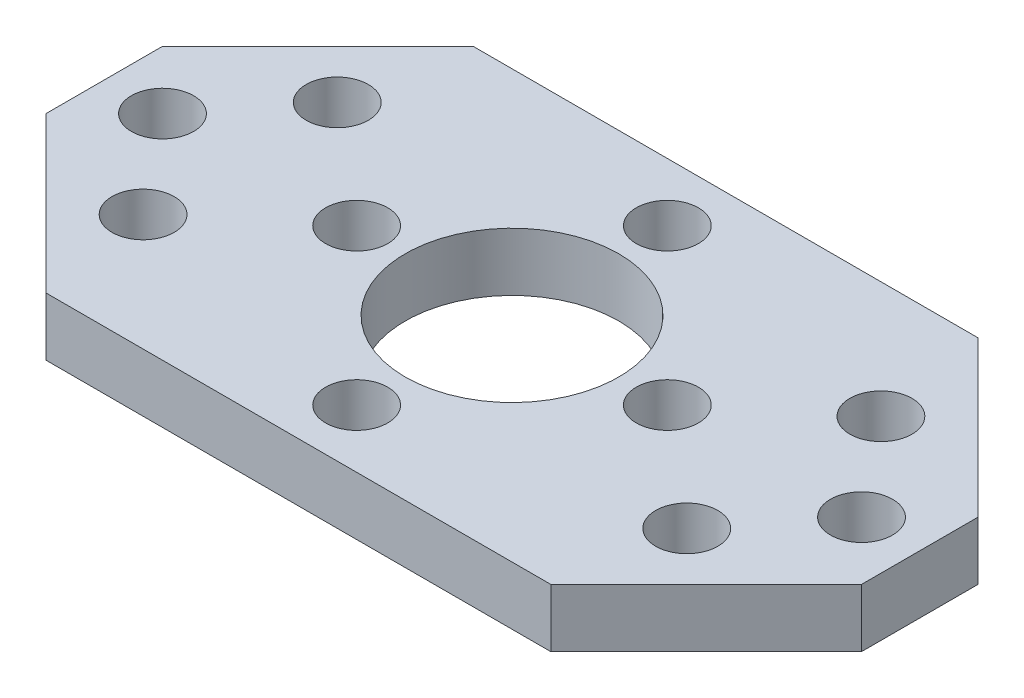
ISO-10303-21;
HEADER;
FILE_DESCRIPTION(('STEP AP214'),'2;1');
FILE_NAME('part.step','',(''),(''),'','','');
FILE_SCHEMA(('AUTOMOTIVE_DESIGN { 1 0 10303 214 1 1 1 1 }'));
ENDSEC;
DATA;
#1=APPLICATION_CONTEXT('core data for automotive mechanical design processes');
#2=APPLICATION_PROTOCOL_DEFINITION('international standard','automotive_design',2000,#1);
#3=PRODUCT_CONTEXT('',#1,'mechanical');
#4=PRODUCT('Part','Part','',(#3));
#5=PRODUCT_RELATED_PRODUCT_CATEGORY('part','',(#4));
#6=PRODUCT_DEFINITION_FORMATION('','',#4);
#7=PRODUCT_DEFINITION_CONTEXT('part definition',#1,'design');
#8=PRODUCT_DEFINITION('design','',#6,#7);
#9=PRODUCT_DEFINITION_SHAPE('','',#8);
#10=(LENGTH_UNIT() NAMED_UNIT(*) SI_UNIT(.MILLI.,.METRE.));
#11=(NAMED_UNIT(*) PLANE_ANGLE_UNIT() SI_UNIT($,.RADIAN.));
#12=(NAMED_UNIT(*) SI_UNIT($,.STERADIAN.) SOLID_ANGLE_UNIT());
#13=UNCERTAINTY_MEASURE_WITH_UNIT(LENGTH_MEASURE(1.E-05),#10,'distance_accuracy_value','');
#14=(GEOMETRIC_REPRESENTATION_CONTEXT(3) GLOBAL_UNCERTAINTY_ASSIGNED_CONTEXT((#13)) GLOBAL_UNIT_ASSIGNED_CONTEXT((#10,
#11,#12)) REPRESENTATION_CONTEXT('',''));
#15=CARTESIAN_POINT('',(0.,0.,0.));
#16=DIRECTION('',(0.,0.,1.));
#17=DIRECTION('',(1.,0.,0.));
#18=AXIS2_PLACEMENT_3D('',#15,#16,#17);
#19=CARTESIAN_POINT('',(0.,3.,0.));
#20=DIRECTION('',(0.,-1.,0.));
#21=DIRECTION('',(0.,0.,-1.));
#22=AXIS2_PLACEMENT_3D('',#19,#20,#21);
#23=PLANE('',#22);
#24=DIRECTION('',(0.,0.,1.));
#25=VECTOR('',#24,1.);
#26=CARTESIAN_POINT('',(-21.,3.,3.));
#27=LINE('',#26,#25);
#28=CARTESIAN_POINT('',(-21.,3.,-3.));
#29=VERTEX_POINT('',#28);
#30=CARTESIAN_POINT('',(-21.,3.,3.));
#31=VERTEX_POINT('',#30);
#32=EDGE_CURVE('E171',#29,#31,#27,.T.);
#33=ORIENTED_EDGE('',*,*,#32,.T.);
#34=DIRECTION('',(0.707106781186548,0.,0.707106781186548));
#35=VECTOR('',#34,1.);
#36=CARTESIAN_POINT('',(-21.,3.,3.));
#37=LINE('',#36,#35);
#38=CARTESIAN_POINT('',(-13.,3.,11.));
#39=VERTEX_POINT('',#38);
#40=EDGE_CURVE('E106',#31,#39,#37,.T.);
#41=ORIENTED_EDGE('',*,*,#40,.T.);
#42=DIRECTION('',(1.,0.,0.));
#43=VECTOR('',#42,1.);
#44=CARTESIAN_POINT('',(-13.,3.,11.));
#45=LINE('',#44,#43);
#46=CARTESIAN_POINT('',(13.,3.,11.));
#47=VERTEX_POINT('',#46);
#48=EDGE_CURVE('E194',#39,#47,#45,.T.);
#49=ORIENTED_EDGE('',*,*,#48,.T.);
#50=DIRECTION('',(0.707106781186548,0.,-0.707106781186548));
#51=VECTOR('',#50,1.);
#52=CARTESIAN_POINT('',(13.,3.,11.));
#53=LINE('',#52,#51);
#54=CARTESIAN_POINT('',(21.,3.,3.));
#55=VERTEX_POINT('',#54);
#56=EDGE_CURVE('E208',#47,#55,#53,.T.);
#57=ORIENTED_EDGE('',*,*,#56,.T.);
#58=DIRECTION('',(0.,0.,-1.));
#59=VECTOR('',#58,1.);
#60=CARTESIAN_POINT('',(21.,3.,3.));
#61=LINE('',#60,#59);
#62=CARTESIAN_POINT('',(21.,3.,-3.));
#63=VERTEX_POINT('',#62);
#64=EDGE_CURVE('E125',#55,#63,#61,.T.);
#65=ORIENTED_EDGE('',*,*,#64,.T.);
#66=DIRECTION('',(-0.707106781186548,0.,-0.707106781186548));
#67=VECTOR('',#66,1.);
#68=CARTESIAN_POINT('',(13.,3.,-11.));
#69=LINE('',#68,#67);
#70=CARTESIAN_POINT('',(13.,3.,-11.));
#71=VERTEX_POINT('',#70);
#72=EDGE_CURVE('E119',#63,#71,#69,.T.);
#73=ORIENTED_EDGE('',*,*,#72,.T.);
#74=DIRECTION('',(-1.,0.,0.));
#75=VECTOR('',#74,1.);
#76=CARTESIAN_POINT('',(-13.,3.,-11.));
#77=LINE('',#76,#75);
#78=CARTESIAN_POINT('',(-13.,3.,-11.));
#79=VERTEX_POINT('',#78);
#80=EDGE_CURVE('E123',#71,#79,#77,.T.);
#81=ORIENTED_EDGE('',*,*,#80,.T.);
#82=DIRECTION('',(-0.707106781186548,0.,0.707106781186548));
#83=VECTOR('',#82,1.);
#84=CARTESIAN_POINT('',(-21.,3.,-3.));
#85=LINE('',#84,#83);
#86=EDGE_CURVE('E63',#79,#29,#85,.T.);
#87=ORIENTED_EDGE('',*,*,#86,.T.);
#88=EDGE_LOOP('',(#33,#41,#49,#57,#65,#73,#81,#87));
#89=FACE_BOUND('',#88,.T.);
#90=CARTESIAN_POINT('',(0.,3.,8.));
#91=DIRECTION('',(0.,1.,0.));
#92=DIRECTION('',(0.,0.,-1.));
#93=AXIS2_PLACEMENT_3D('',#90,#91,#92);
#94=CIRCLE('',#93,1.6);
#95=CARTESIAN_POINT('',(0.,3.,6.4));
#96=VERTEX_POINT('',#95);
#97=EDGE_CURVE('E154',#96,#96,#94,.T.);
#98=ORIENTED_EDGE('',*,*,#97,.F.);
#99=EDGE_LOOP('',(#98));
#100=FACE_BOUND('',#99,.T.);
#101=CARTESIAN_POINT('',(0.,3.,-8.));
#102=DIRECTION('',(0.,1.,0.));
#103=DIRECTION('',(0.,0.,1.));
#104=AXIS2_PLACEMENT_3D('',#101,#102,#103);
#105=CIRCLE('',#104,1.6);
#106=CARTESIAN_POINT('',(0.,3.,-6.4));
#107=VERTEX_POINT('',#106);
#108=EDGE_CURVE('E223',#107,#107,#105,.T.);
#109=ORIENTED_EDGE('',*,*,#108,.F.);
#110=EDGE_LOOP('',(#109));
#111=FACE_BOUND('',#110,.T.);
#112=CARTESIAN_POINT('',(8.,3.,0.));
#113=DIRECTION('',(0.,1.,0.));
#114=DIRECTION('',(0.,0.,1.));
#115=AXIS2_PLACEMENT_3D('',#112,#113,#114);
#116=CIRCLE('',#115,1.6);
#117=CARTESIAN_POINT('',(8.,3.,1.6));
#118=VERTEX_POINT('',#117);
#119=EDGE_CURVE('E230',#118,#118,#116,.T.);
#120=ORIENTED_EDGE('',*,*,#119,.F.);
#121=EDGE_LOOP('',(#120));
#122=FACE_BOUND('',#121,.T.);
#123=CARTESIAN_POINT('',(-8.,3.,0.));
#124=DIRECTION('',(0.,1.,0.));
#125=DIRECTION('',(0.,0.,-1.));
#126=AXIS2_PLACEMENT_3D('',#123,#124,#125);
#127=CIRCLE('',#126,1.6);
#128=CARTESIAN_POINT('',(-8.,3.,-1.6));
#129=VERTEX_POINT('',#128);
#130=EDGE_CURVE('E237',#129,#129,#127,.T.);
#131=ORIENTED_EDGE('',*,*,#130,.F.);
#132=EDGE_LOOP('',(#131));
#133=FACE_BOUND('',#132,.T.);
#134=CARTESIAN_POINT('',(-18.,3.,0.));
#135=DIRECTION('',(0.,1.,0.));
#136=DIRECTION('',(0.,0.,1.));
#137=AXIS2_PLACEMENT_3D('',#134,#135,#136);
#138=CIRCLE('',#137,1.6);
#139=CARTESIAN_POINT('',(-18.,3.,1.6));
#140=VERTEX_POINT('',#139);
#141=EDGE_CURVE('E245',#140,#140,#138,.T.);
#142=ORIENTED_EDGE('',*,*,#141,.F.);
#143=EDGE_LOOP('',(#142));
#144=FACE_BOUND('',#143,.T.);
#145=CARTESIAN_POINT('',(-14.,3.,-5.));
#146=DIRECTION('',(0.,1.,0.));
#147=DIRECTION('',(0.,0.,1.));
#148=AXIS2_PLACEMENT_3D('',#145,#146,#147);
#149=CIRCLE('',#148,1.6);
#150=CARTESIAN_POINT('',(-14.,3.,-3.4));
#151=VERTEX_POINT('',#150);
#152=EDGE_CURVE('E253',#151,#151,#149,.T.);
#153=ORIENTED_EDGE('',*,*,#152,.F.);
#154=EDGE_LOOP('',(#153));
#155=FACE_BOUND('',#154,.T.);
#156=CARTESIAN_POINT('',(-14.,3.,5.));
#157=DIRECTION('',(0.,1.,0.));
#158=DIRECTION('',(0.,0.,-1.));
#159=AXIS2_PLACEMENT_3D('',#156,#157,#158);
#160=CIRCLE('',#159,1.6);
#161=CARTESIAN_POINT('',(-14.,3.,3.4));
#162=VERTEX_POINT('',#161);
#163=EDGE_CURVE('E260',#162,#162,#160,.T.);
#164=ORIENTED_EDGE('',*,*,#163,.F.);
#165=EDGE_LOOP('',(#164));
#166=FACE_BOUND('',#165,.T.);
#167=CARTESIAN_POINT('',(14.,3.,5.));
#168=DIRECTION('',(0.,1.,0.));
#169=DIRECTION('',(0.,0.,1.));
#170=AXIS2_PLACEMENT_3D('',#167,#168,#169);
#171=CIRCLE('',#170,1.6);
#172=CARTESIAN_POINT('',(14.,3.,6.6));
#173=VERTEX_POINT('',#172);
#174=EDGE_CURVE('E268',#173,#173,#171,.T.);
#175=ORIENTED_EDGE('',*,*,#174,.F.);
#176=EDGE_LOOP('',(#175));
#177=FACE_BOUND('',#176,.T.);
#178=CARTESIAN_POINT('',(18.,3.,0.));
#179=DIRECTION('',(0.,1.,0.));
#180=DIRECTION('',(0.,0.,-1.));
#181=AXIS2_PLACEMENT_3D('',#178,#179,#180);
#182=CIRCLE('',#181,1.6);
#183=CARTESIAN_POINT('',(18.,3.,-1.6));
#184=VERTEX_POINT('',#183);
#185=EDGE_CURVE('E275',#184,#184,#182,.T.);
#186=ORIENTED_EDGE('',*,*,#185,.F.);
#187=EDGE_LOOP('',(#186));
#188=FACE_BOUND('',#187,.T.);
#189=CARTESIAN_POINT('',(14.,3.,-5.));
#190=DIRECTION('',(0.,1.,0.));
#191=DIRECTION('',(0.,0.,-1.));
#192=AXIS2_PLACEMENT_3D('',#189,#190,#191);
#193=CIRCLE('',#192,1.6);
#194=CARTESIAN_POINT('',(14.,3.,-6.6));
#195=VERTEX_POINT('',#194);
#196=EDGE_CURVE('E283',#195,#195,#193,.T.);
#197=ORIENTED_EDGE('',*,*,#196,.F.);
#198=EDGE_LOOP('',(#197));
#199=FACE_BOUND('',#198,.T.);
#200=CARTESIAN_POINT('',(0.,3.,0.));
#201=DIRECTION('',(0.,1.,0.));
#202=DIRECTION('',(0.,0.,1.));
#203=AXIS2_PLACEMENT_3D('',#200,#201,#202);
#204=CIRCLE('',#203,5.5);
#205=CARTESIAN_POINT('',(0.,3.,5.5));
#206=VERTEX_POINT('',#205);
#207=EDGE_CURVE('E291',#206,#206,#204,.T.);
#208=ORIENTED_EDGE('',*,*,#207,.F.);
#209=EDGE_LOOP('',(#208));
#210=FACE_BOUND('',#209,.T.);
#211=ADVANCED_FACE('F45',(#89,#100,#111,#122,#133,#144,#155,#166,#177,#188,#199,#210),#23,.F.);
#212=CARTESIAN_POINT('',(0.,0.,0.));
#213=DIRECTION('',(0.,-1.,0.));
#214=DIRECTION('',(0.,0.,-1.));
#215=AXIS2_PLACEMENT_3D('',#212,#213,#214);
#216=PLANE('',#215);
#217=CARTESIAN_POINT('',(14.,0.,-5.));
#218=DIRECTION('',(0.,1.,0.));
#219=DIRECTION('',(0.,0.,-1.));
#220=AXIS2_PLACEMENT_3D('',#217,#218,#219);
#221=CIRCLE('',#220,1.6);
#222=CARTESIAN_POINT('',(14.,0.,-6.6));
#223=VERTEX_POINT('',#222);
#224=EDGE_CURVE('E287',#223,#223,#221,.T.);
#225=ORIENTED_EDGE('',*,*,#224,.T.);
#226=EDGE_LOOP('',(#225));
#227=FACE_BOUND('',#226,.T.);
#228=CARTESIAN_POINT('',(14.,0.,5.));
#229=DIRECTION('',(0.,1.,0.));
#230=DIRECTION('',(0.,0.,1.));
#231=AXIS2_PLACEMENT_3D('',#228,#229,#230);
#232=CIRCLE('',#231,1.6);
#233=CARTESIAN_POINT('',(14.,0.,6.6));
#234=VERTEX_POINT('',#233);
#235=EDGE_CURVE('E272',#234,#234,#232,.T.);
#236=ORIENTED_EDGE('',*,*,#235,.T.);
#237=EDGE_LOOP('',(#236));
#238=FACE_BOUND('',#237,.T.);
#239=CARTESIAN_POINT('',(-14.,0.,-5.));
#240=DIRECTION('',(0.,1.,0.));
#241=DIRECTION('',(0.,0.,1.));
#242=AXIS2_PLACEMENT_3D('',#239,#240,#241);
#243=CIRCLE('',#242,1.6);
#244=CARTESIAN_POINT('',(-14.,0.,-3.4));
#245=VERTEX_POINT('',#244);
#246=EDGE_CURVE('E257',#245,#245,#243,.T.);
#247=ORIENTED_EDGE('',*,*,#246,.T.);
#248=EDGE_LOOP('',(#247));
#249=FACE_BOUND('',#248,.T.);
#250=CARTESIAN_POINT('',(-8.,0.,0.));
#251=DIRECTION('',(0.,1.,0.));
#252=DIRECTION('',(0.,0.,-1.));
#253=AXIS2_PLACEMENT_3D('',#250,#251,#252);
#254=CIRCLE('',#253,1.6);
#255=CARTESIAN_POINT('',(-8.,0.,-1.6));
#256=VERTEX_POINT('',#255);
#257=EDGE_CURVE('E241',#256,#256,#254,.T.);
#258=ORIENTED_EDGE('',*,*,#257,.T.);
#259=EDGE_LOOP('',(#258));
#260=FACE_BOUND('',#259,.T.);
#261=CARTESIAN_POINT('',(0.,0.,-8.));
#262=DIRECTION('',(0.,1.,0.));
#263=DIRECTION('',(0.,0.,1.));
#264=AXIS2_PLACEMENT_3D('',#261,#262,#263);
#265=CIRCLE('',#264,1.6);
#266=CARTESIAN_POINT('',(0.,0.,-6.4));
#267=VERTEX_POINT('',#266);
#268=EDGE_CURVE('E226',#267,#267,#265,.T.);
#269=ORIENTED_EDGE('',*,*,#268,.T.);
#270=EDGE_LOOP('',(#269));
#271=FACE_BOUND('',#270,.T.);
#272=DIRECTION('',(0.,0.,1.));
#273=VECTOR('',#272,1.);
#274=CARTESIAN_POINT('',(-21.,0.,3.));
#275=LINE('',#274,#273);
#276=CARTESIAN_POINT('',(-21.,0.,-3.));
#277=VERTEX_POINT('',#276);
#278=CARTESIAN_POINT('',(-21.,0.,3.));
#279=VERTEX_POINT('',#278);
#280=EDGE_CURVE('E149',#277,#279,#275,.T.);
#281=ORIENTED_EDGE('',*,*,#280,.F.);
#282=DIRECTION('',(-0.707106781186548,0.,0.707106781186548));
#283=VECTOR('',#282,1.);
#284=CARTESIAN_POINT('',(-21.,0.,-3.));
#285=LINE('',#284,#283);
#286=CARTESIAN_POINT('',(-13.,0.,-11.));
#287=VERTEX_POINT('',#286);
#288=EDGE_CURVE('E98',#287,#277,#285,.T.);
#289=ORIENTED_EDGE('',*,*,#288,.F.);
#290=DIRECTION('',(-1.,0.,0.));
#291=VECTOR('',#290,1.);
#292=CARTESIAN_POINT('',(-13.,0.,-11.));
#293=LINE('',#292,#291);
#294=CARTESIAN_POINT('',(13.,0.,-11.));
#295=VERTEX_POINT('',#294);
#296=EDGE_CURVE('E92',#295,#287,#293,.T.);
#297=ORIENTED_EDGE('',*,*,#296,.F.);
#298=DIRECTION('',(-0.707106781186548,0.,-0.707106781186548));
#299=VECTOR('',#298,1.);
#300=CARTESIAN_POINT('',(13.,0.,-11.));
#301=LINE('',#300,#299);
#302=CARTESIAN_POINT('',(21.,0.,-3.));
#303=VERTEX_POINT('',#302);
#304=EDGE_CURVE('E134',#303,#295,#301,.T.);
#305=ORIENTED_EDGE('',*,*,#304,.F.);
#306=DIRECTION('',(0.,0.,-1.));
#307=VECTOR('',#306,1.);
#308=CARTESIAN_POINT('',(21.,0.,3.));
#309=LINE('',#308,#307);
#310=CARTESIAN_POINT('',(21.,0.,3.));
#311=VERTEX_POINT('',#310);
#312=EDGE_CURVE('E163',#311,#303,#309,.T.);
#313=ORIENTED_EDGE('',*,*,#312,.F.);
#314=DIRECTION('',(0.707106781186548,0.,-0.707106781186548));
#315=VECTOR('',#314,1.);
#316=CARTESIAN_POINT('',(13.,0.,11.));
#317=LINE('',#316,#315);
#318=CARTESIAN_POINT('',(13.,0.,11.));
#319=VERTEX_POINT('',#318);
#320=EDGE_CURVE('E160',#319,#311,#317,.T.);
#321=ORIENTED_EDGE('',*,*,#320,.F.);
#322=DIRECTION('',(1.,0.,0.));
#323=VECTOR('',#322,1.);
#324=CARTESIAN_POINT('',(-13.,0.,11.));
#325=LINE('',#324,#323);
#326=CARTESIAN_POINT('',(-13.,0.,11.));
#327=VERTEX_POINT('',#326);
#328=EDGE_CURVE('E157',#327,#319,#325,.T.);
#329=ORIENTED_EDGE('',*,*,#328,.F.);
#330=DIRECTION('',(0.707106781186548,0.,0.707106781186548));
#331=VECTOR('',#330,1.);
#332=CARTESIAN_POINT('',(-21.,0.,3.));
#333=LINE('',#332,#331);
#334=EDGE_CURVE('E153',#279,#327,#333,.T.);
#335=ORIENTED_EDGE('',*,*,#334,.F.);
#336=EDGE_LOOP('',(#281,#289,#297,#305,#313,#321,#329,#335));
#337=FACE_BOUND('',#336,.T.);
#338=CARTESIAN_POINT('',(0.,0.,8.));
#339=DIRECTION('',(0.,1.,0.));
#340=DIRECTION('',(0.,0.,-1.));
#341=AXIS2_PLACEMENT_3D('',#338,#339,#340);
#342=CIRCLE('',#341,1.6);
#343=CARTESIAN_POINT('',(0.,0.,6.4));
#344=VERTEX_POINT('',#343);
#345=EDGE_CURVE('E219',#344,#344,#342,.T.);
#346=ORIENTED_EDGE('',*,*,#345,.T.);
#347=EDGE_LOOP('',(#346));
#348=FACE_BOUND('',#347,.T.);
#349=CARTESIAN_POINT('',(8.,0.,0.));
#350=DIRECTION('',(0.,1.,0.));
#351=DIRECTION('',(0.,0.,1.));
#352=AXIS2_PLACEMENT_3D('',#349,#350,#351);
#353=CIRCLE('',#352,1.6);
#354=CARTESIAN_POINT('',(8.,0.,1.6));
#355=VERTEX_POINT('',#354);
#356=EDGE_CURVE('E234',#355,#355,#353,.T.);
#357=ORIENTED_EDGE('',*,*,#356,.T.);
#358=EDGE_LOOP('',(#357));
#359=FACE_BOUND('',#358,.T.);
#360=CARTESIAN_POINT('',(-18.,0.,0.));
#361=DIRECTION('',(0.,1.,0.));
#362=DIRECTION('',(0.,0.,1.));
#363=AXIS2_PLACEMENT_3D('',#360,#361,#362);
#364=CIRCLE('',#363,1.6);
#365=CARTESIAN_POINT('',(-18.,0.,1.6));
#366=VERTEX_POINT('',#365);
#367=EDGE_CURVE('E249',#366,#366,#364,.T.);
#368=ORIENTED_EDGE('',*,*,#367,.T.);
#369=EDGE_LOOP('',(#368));
#370=FACE_BOUND('',#369,.T.);
#371=CARTESIAN_POINT('',(-14.,0.,5.));
#372=DIRECTION('',(0.,1.,0.));
#373=DIRECTION('',(0.,0.,-1.));
#374=AXIS2_PLACEMENT_3D('',#371,#372,#373);
#375=CIRCLE('',#374,1.6);
#376=CARTESIAN_POINT('',(-14.,0.,3.4));
#377=VERTEX_POINT('',#376);
#378=EDGE_CURVE('E264',#377,#377,#375,.T.);
#379=ORIENTED_EDGE('',*,*,#378,.T.);
#380=EDGE_LOOP('',(#379));
#381=FACE_BOUND('',#380,.T.);
#382=CARTESIAN_POINT('',(18.,0.,0.));
#383=DIRECTION('',(0.,1.,0.));
#384=DIRECTION('',(0.,0.,-1.));
#385=AXIS2_PLACEMENT_3D('',#382,#383,#384);
#386=CIRCLE('',#385,1.6);
#387=CARTESIAN_POINT('',(18.,0.,-1.6));
#388=VERTEX_POINT('',#387);
#389=EDGE_CURVE('E279',#388,#388,#386,.T.);
#390=ORIENTED_EDGE('',*,*,#389,.T.);
#391=EDGE_LOOP('',(#390));
#392=FACE_BOUND('',#391,.T.);
#393=CARTESIAN_POINT('',(0.,0.,0.));
#394=DIRECTION('',(0.,1.,0.));
#395=DIRECTION('',(0.,0.,1.));
#396=AXIS2_PLACEMENT_3D('',#393,#394,#395);
#397=CIRCLE('',#396,5.5);
#398=CARTESIAN_POINT('',(0.,0.,5.5));
#399=VERTEX_POINT('',#398);
#400=EDGE_CURVE('E295',#399,#399,#397,.T.);
#401=ORIENTED_EDGE('',*,*,#400,.T.);
#402=EDGE_LOOP('',(#401));
#403=FACE_BOUND('',#402,.T.);
#404=ADVANCED_FACE('F198',(#227,#238,#249,#260,#271,#337,#348,#359,#370,#381,#392,#403),#216,.T.);
#405=CARTESIAN_POINT('',(-21.,3.,3.));
#406=DIRECTION('',(1.,0.,0.));
#407=DIRECTION('',(0.,0.,-1.));
#408=AXIS2_PLACEMENT_3D('',#405,#406,#407);
#409=PLANE('',#408);
#410=ORIENTED_EDGE('',*,*,#280,.T.);
#411=DIRECTION('',(0.,-1.,0.));
#412=VECTOR('',#411,1.);
#413=CARTESIAN_POINT('',(-21.,3.,3.));
#414=LINE('',#413,#412);
#415=EDGE_CURVE('E11',#31,#279,#414,.T.);
#416=ORIENTED_EDGE('',*,*,#415,.F.);
#417=ORIENTED_EDGE('',*,*,#32,.F.);
#418=DIRECTION('',(0.,-1.,0.));
#419=VECTOR('',#418,1.);
#420=CARTESIAN_POINT('',(-21.,3.,-3.));
#421=LINE('',#420,#419);
#422=EDGE_CURVE('E145',#29,#277,#421,.T.);
#423=ORIENTED_EDGE('',*,*,#422,.T.);
#424=EDGE_LOOP('',(#410,#416,#417,#423));
#425=FACE_BOUND('',#424,.T.);
#426=ADVANCED_FACE('F47',(#425),#409,.F.);
#427=CARTESIAN_POINT('',(-21.,3.,3.));
#428=DIRECTION('',(0.707106781186547,0.,-0.707106781186547));
#429=DIRECTION('',(-0.707106781186548,0.,-0.707106781186548));
#430=AXIS2_PLACEMENT_3D('',#427,#428,#429);
#431=PLANE('',#430);
#432=ORIENTED_EDGE('',*,*,#334,.T.);
#433=DIRECTION('',(0.,-1.,0.));
#434=VECTOR('',#433,1.);
#435=CARTESIAN_POINT('',(-13.,3.,11.));
#436=LINE('',#435,#434);
#437=EDGE_CURVE('E55',#39,#327,#436,.T.);
#438=ORIENTED_EDGE('',*,*,#437,.F.);
#439=ORIENTED_EDGE('',*,*,#40,.F.);
#440=ORIENTED_EDGE('',*,*,#415,.T.);
#441=EDGE_LOOP('',(#432,#438,#439,#440));
#442=FACE_BOUND('',#441,.T.);
#443=ADVANCED_FACE('F328',(#442),#431,.F.);
#444=CARTESIAN_POINT('',(-13.,3.,11.));
#445=DIRECTION('',(0.,0.,-1.));
#446=DIRECTION('',(-1.,0.,0.));
#447=AXIS2_PLACEMENT_3D('',#444,#445,#446);
#448=PLANE('',#447);
#449=ORIENTED_EDGE('',*,*,#328,.T.);
#450=DIRECTION('',(0.,-1.,0.));
#451=VECTOR('',#450,1.);
#452=CARTESIAN_POINT('',(13.,3.,11.));
#453=LINE('',#452,#451);
#454=EDGE_CURVE('E182',#47,#319,#453,.T.);
#455=ORIENTED_EDGE('',*,*,#454,.F.);
#456=ORIENTED_EDGE('',*,*,#48,.F.);
#457=ORIENTED_EDGE('',*,*,#437,.T.);
#458=EDGE_LOOP('',(#449,#455,#456,#457));
#459=FACE_BOUND('',#458,.T.);
#460=ADVANCED_FACE('F192',(#459),#448,.F.);
#461=CARTESIAN_POINT('',(13.,3.,11.));
#462=DIRECTION('',(-0.707106781186547,0.,-0.707106781186547));
#463=DIRECTION('',(-0.707106781186548,0.,0.707106781186548));
#464=AXIS2_PLACEMENT_3D('',#461,#462,#463);
#465=PLANE('',#464);
#466=ORIENTED_EDGE('',*,*,#320,.T.);
#467=DIRECTION('',(0.,-1.,0.));
#468=VECTOR('',#467,1.);
#469=CARTESIAN_POINT('',(21.,3.,3.));
#470=LINE('',#469,#468);
#471=EDGE_CURVE('E178',#55,#311,#470,.T.);
#472=ORIENTED_EDGE('',*,*,#471,.F.);
#473=ORIENTED_EDGE('',*,*,#56,.F.);
#474=ORIENTED_EDGE('',*,*,#454,.T.);
#475=EDGE_LOOP('',(#466,#472,#473,#474));
#476=FACE_BOUND('',#475,.T.);
#477=ADVANCED_FACE('F203',(#476),#465,.F.);
#478=CARTESIAN_POINT('',(21.,3.,3.));
#479=DIRECTION('',(-1.,0.,0.));
#480=DIRECTION('',(0.,0.,1.));
#481=AXIS2_PLACEMENT_3D('',#478,#479,#480);
#482=PLANE('',#481);
#483=ORIENTED_EDGE('',*,*,#312,.T.);
#484=DIRECTION('',(0.,-1.,0.));
#485=VECTOR('',#484,1.);
#486=CARTESIAN_POINT('',(21.,3.,-3.));
#487=LINE('',#486,#485);
#488=EDGE_CURVE('E136',#63,#303,#487,.T.);
#489=ORIENTED_EDGE('',*,*,#488,.F.);
#490=ORIENTED_EDGE('',*,*,#64,.F.);
#491=ORIENTED_EDGE('',*,*,#471,.T.);
#492=EDGE_LOOP('',(#483,#489,#490,#491));
#493=FACE_BOUND('',#492,.T.);
#494=ADVANCED_FACE('F206',(#493),#482,.F.);
#495=CARTESIAN_POINT('',(13.,3.,-11.));
#496=DIRECTION('',(-0.707106781186547,0.,0.707106781186548));
#497=DIRECTION('',(0.707106781186548,0.,0.707106781186547));
#498=AXIS2_PLACEMENT_3D('',#495,#496,#497);
#499=PLANE('',#498);
#500=ORIENTED_EDGE('',*,*,#304,.T.);
#501=DIRECTION('',(0.,-1.,0.));
#502=VECTOR('',#501,1.);
#503=CARTESIAN_POINT('',(13.,3.,-11.));
#504=LINE('',#503,#502);
#505=EDGE_CURVE('E131',#71,#295,#504,.T.);
#506=ORIENTED_EDGE('',*,*,#505,.F.);
#507=ORIENTED_EDGE('',*,*,#72,.F.);
#508=ORIENTED_EDGE('',*,*,#488,.T.);
#509=EDGE_LOOP('',(#500,#506,#507,#508));
#510=FACE_BOUND('',#509,.T.);
#511=ADVANCED_FACE('F132',(#510),#499,.F.);
#512=CARTESIAN_POINT('',(-13.,3.,-11.));
#513=DIRECTION('',(0.,0.,1.));
#514=DIRECTION('',(1.,0.,0.));
#515=AXIS2_PLACEMENT_3D('',#512,#513,#514);
#516=PLANE('',#515);
#517=ORIENTED_EDGE('',*,*,#296,.T.);
#518=DIRECTION('',(0.,-1.,0.));
#519=VECTOR('',#518,1.);
#520=CARTESIAN_POINT('',(-13.,3.,-11.));
#521=LINE('',#520,#519);
#522=EDGE_CURVE('E137',#79,#287,#521,.T.);
#523=ORIENTED_EDGE('',*,*,#522,.F.);
#524=ORIENTED_EDGE('',*,*,#80,.F.);
#525=ORIENTED_EDGE('',*,*,#505,.T.);
#526=EDGE_LOOP('',(#517,#523,#524,#525));
#527=FACE_BOUND('',#526,.T.);
#528=ADVANCED_FACE('F139',(#527),#516,.F.);
#529=CARTESIAN_POINT('',(-21.,3.,-3.));
#530=DIRECTION('',(0.707106781186547,0.,0.707106781186547));
#531=DIRECTION('',(0.707106781186548,0.,-0.707106781186548));
#532=AXIS2_PLACEMENT_3D('',#529,#530,#531);
#533=PLANE('',#532);
#534=ORIENTED_EDGE('',*,*,#288,.T.);
#535=ORIENTED_EDGE('',*,*,#422,.F.);
#536=ORIENTED_EDGE('',*,*,#86,.F.);
#537=ORIENTED_EDGE('',*,*,#522,.T.);
#538=EDGE_LOOP('',(#534,#535,#536,#537));
#539=FACE_BOUND('',#538,.T.);
#540=ADVANCED_FACE('F316',(#539),#533,.F.);
#541=CARTESIAN_POINT('',(0.,3.,8.));
#542=DIRECTION('',(0.,-1.,0.));
#543=DIRECTION('',(0.,0.,-1.));
#544=AXIS2_PLACEMENT_3D('',#541,#542,#543);
#545=CYLINDRICAL_SURFACE('',#544,1.6);
#546=ORIENTED_EDGE('',*,*,#97,.T.);
#547=EDGE_LOOP('',(#546));
#548=FACE_BOUND('',#547,.T.);
#549=ORIENTED_EDGE('',*,*,#345,.F.);
#550=EDGE_LOOP('',(#549));
#551=FACE_BOUND('',#550,.T.);
#552=ADVANCED_FACE('F313',(#548,#551),#545,.F.);
#553=CARTESIAN_POINT('',(0.,3.,-8.));
#554=DIRECTION('',(0.,-1.,0.));
#555=DIRECTION('',(0.,0.,-1.));
#556=AXIS2_PLACEMENT_3D('',#553,#554,#555);
#557=CYLINDRICAL_SURFACE('',#556,1.6);
#558=ORIENTED_EDGE('',*,*,#108,.T.);
#559=EDGE_LOOP('',(#558));
#560=FACE_BOUND('',#559,.T.);
#561=ORIENTED_EDGE('',*,*,#268,.F.);
#562=EDGE_LOOP('',(#561));
#563=FACE_BOUND('',#562,.T.);
#564=ADVANCED_FACE('F389',(#560,#563),#557,.F.);
#565=CARTESIAN_POINT('',(8.,3.,0.));
#566=DIRECTION('',(0.,-1.,0.));
#567=DIRECTION('',(0.,0.,-1.));
#568=AXIS2_PLACEMENT_3D('',#565,#566,#567);
#569=CYLINDRICAL_SURFACE('',#568,1.6);
#570=ORIENTED_EDGE('',*,*,#119,.T.);
#571=EDGE_LOOP('',(#570));
#572=FACE_BOUND('',#571,.T.);
#573=ORIENTED_EDGE('',*,*,#356,.F.);
#574=EDGE_LOOP('',(#573));
#575=FACE_BOUND('',#574,.T.);
#576=ADVANCED_FACE('F397',(#572,#575),#569,.F.);
#577=CARTESIAN_POINT('',(-8.,3.,0.));
#578=DIRECTION('',(0.,-1.,0.));
#579=DIRECTION('',(0.,0.,-1.));
#580=AXIS2_PLACEMENT_3D('',#577,#578,#579);
#581=CYLINDRICAL_SURFACE('',#580,1.6);
#582=ORIENTED_EDGE('',*,*,#130,.T.);
#583=EDGE_LOOP('',(#582));
#584=FACE_BOUND('',#583,.T.);
#585=ORIENTED_EDGE('',*,*,#257,.F.);
#586=EDGE_LOOP('',(#585));
#587=FACE_BOUND('',#586,.T.);
#588=ADVANCED_FACE('F405',(#584,#587),#581,.F.);
#589=CARTESIAN_POINT('',(-18.,3.,0.));
#590=DIRECTION('',(0.,-1.,0.));
#591=DIRECTION('',(0.,0.,-1.));
#592=AXIS2_PLACEMENT_3D('',#589,#590,#591);
#593=CYLINDRICAL_SURFACE('',#592,1.6);
#594=ORIENTED_EDGE('',*,*,#141,.T.);
#595=EDGE_LOOP('',(#594));
#596=FACE_BOUND('',#595,.T.);
#597=ORIENTED_EDGE('',*,*,#367,.F.);
#598=EDGE_LOOP('',(#597));
#599=FACE_BOUND('',#598,.T.);
#600=ADVANCED_FACE('F414',(#596,#599),#593,.F.);
#601=CARTESIAN_POINT('',(-14.,3.,-5.));
#602=DIRECTION('',(0.,-1.,0.));
#603=DIRECTION('',(0.,0.,-1.));
#604=AXIS2_PLACEMENT_3D('',#601,#602,#603);
#605=CYLINDRICAL_SURFACE('',#604,1.6);
#606=ORIENTED_EDGE('',*,*,#152,.T.);
#607=EDGE_LOOP('',(#606));
#608=FACE_BOUND('',#607,.T.);
#609=ORIENTED_EDGE('',*,*,#246,.F.);
#610=EDGE_LOOP('',(#609));
#611=FACE_BOUND('',#610,.T.);
#612=ADVANCED_FACE('F423',(#608,#611),#605,.F.);
#613=CARTESIAN_POINT('',(-14.,3.,5.));
#614=DIRECTION('',(0.,-1.,0.));
#615=DIRECTION('',(0.,0.,-1.));
#616=AXIS2_PLACEMENT_3D('',#613,#614,#615);
#617=CYLINDRICAL_SURFACE('',#616,1.6);
#618=ORIENTED_EDGE('',*,*,#163,.T.);
#619=EDGE_LOOP('',(#618));
#620=FACE_BOUND('',#619,.T.);
#621=ORIENTED_EDGE('',*,*,#378,.F.);
#622=EDGE_LOOP('',(#621));
#623=FACE_BOUND('',#622,.T.);
#624=ADVANCED_FACE('F432',(#620,#623),#617,.F.);
#625=CARTESIAN_POINT('',(14.,3.,5.));
#626=DIRECTION('',(0.,-1.,0.));
#627=DIRECTION('',(0.,0.,-1.));
#628=AXIS2_PLACEMENT_3D('',#625,#626,#627);
#629=CYLINDRICAL_SURFACE('',#628,1.6);
#630=ORIENTED_EDGE('',*,*,#174,.T.);
#631=EDGE_LOOP('',(#630));
#632=FACE_BOUND('',#631,.T.);
#633=ORIENTED_EDGE('',*,*,#235,.F.);
#634=EDGE_LOOP('',(#633));
#635=FACE_BOUND('',#634,.T.);
#636=ADVANCED_FACE('F441',(#632,#635),#629,.F.);
#637=CARTESIAN_POINT('',(18.,3.,0.));
#638=DIRECTION('',(0.,-1.,0.));
#639=DIRECTION('',(0.,0.,-1.));
#640=AXIS2_PLACEMENT_3D('',#637,#638,#639);
#641=CYLINDRICAL_SURFACE('',#640,1.6);
#642=ORIENTED_EDGE('',*,*,#185,.T.);
#643=EDGE_LOOP('',(#642));
#644=FACE_BOUND('',#643,.T.);
#645=ORIENTED_EDGE('',*,*,#389,.F.);
#646=EDGE_LOOP('',(#645));
#647=FACE_BOUND('',#646,.T.);
#648=ADVANCED_FACE('F450',(#644,#647),#641,.F.);
#649=CARTESIAN_POINT('',(14.,3.,-5.));
#650=DIRECTION('',(0.,-1.,0.));
#651=DIRECTION('',(0.,0.,-1.));
#652=AXIS2_PLACEMENT_3D('',#649,#650,#651);
#653=CYLINDRICAL_SURFACE('',#652,1.6);
#654=ORIENTED_EDGE('',*,*,#196,.T.);
#655=EDGE_LOOP('',(#654));
#656=FACE_BOUND('',#655,.T.);
#657=ORIENTED_EDGE('',*,*,#224,.F.);
#658=EDGE_LOOP('',(#657));
#659=FACE_BOUND('',#658,.T.);
#660=ADVANCED_FACE('F459',(#656,#659),#653,.F.);
#661=CARTESIAN_POINT('',(0.,3.,0.));
#662=DIRECTION('',(0.,-1.,0.));
#663=DIRECTION('',(0.,0.,-1.));
#664=AXIS2_PLACEMENT_3D('',#661,#662,#663);
#665=CYLINDRICAL_SURFACE('',#664,5.5);
#666=ORIENTED_EDGE('',*,*,#207,.T.);
#667=EDGE_LOOP('',(#666));
#668=FACE_BOUND('',#667,.T.);
#669=ORIENTED_EDGE('',*,*,#400,.F.);
#670=EDGE_LOOP('',(#669));
#671=FACE_BOUND('',#670,.T.);
#672=ADVANCED_FACE('F303',(#668,#671),#665,.F.);
#673=CLOSED_SHELL('',(#211,#404,#426,#443,#460,#477,#494,#511,#528,#540,#552,#564,#576,#588,
#600,#612,#624,#636,#648,#660,#672));
#674=MANIFOLD_SOLID_BREP('B2',#673);
#675=ADVANCED_BREP_SHAPE_REPRESENTATION('',(#18,#674),#14);
#676=SHAPE_DEFINITION_REPRESENTATION(#9,#675);
ENDSEC;
END-ISO-10303-21;
